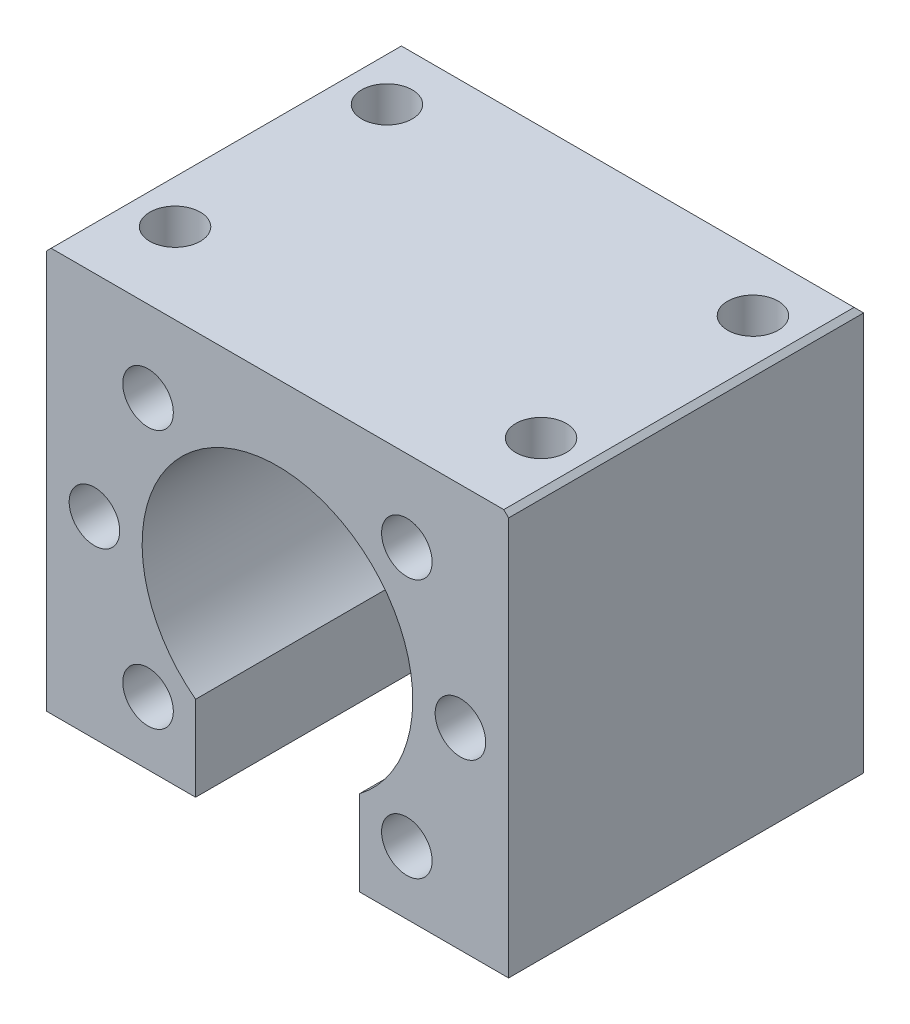
ISO-10303-21;
HEADER;
FILE_DESCRIPTION(('STEP AP214'),'2;1');
FILE_NAME('part.step','',(''),(''),'','','');
FILE_SCHEMA(('AUTOMOTIVE_DESIGN { 1 0 10303 214 1 1 1 1 }'));
ENDSEC;
DATA;
#1=APPLICATION_CONTEXT('core data for automotive mechanical design processes');
#2=APPLICATION_PROTOCOL_DEFINITION('international standard','automotive_design',2000,#1);
#3=PRODUCT_CONTEXT('',#1,'mechanical');
#4=PRODUCT('Part','Part','',(#3));
#5=PRODUCT_RELATED_PRODUCT_CATEGORY('part','',(#4));
#6=PRODUCT_DEFINITION_FORMATION('','',#4);
#7=PRODUCT_DEFINITION_CONTEXT('part definition',#1,'design');
#8=PRODUCT_DEFINITION('design','',#6,#7);
#9=PRODUCT_DEFINITION_SHAPE('','',#8);
#10=(LENGTH_UNIT() NAMED_UNIT(*) SI_UNIT(.MILLI.,.METRE.));
#11=(NAMED_UNIT(*) PLANE_ANGLE_UNIT() SI_UNIT($,.RADIAN.));
#12=(NAMED_UNIT(*) SI_UNIT($,.STERADIAN.) SOLID_ANGLE_UNIT());
#13=UNCERTAINTY_MEASURE_WITH_UNIT(LENGTH_MEASURE(1.E-05),#10,'distance_accuracy_value','');
#14=(GEOMETRIC_REPRESENTATION_CONTEXT(3) GLOBAL_UNCERTAINTY_ASSIGNED_CONTEXT((#13)) GLOBAL_UNIT_ASSIGNED_CONTEXT((#10,
#11,#12)) REPRESENTATION_CONTEXT('',''));
#15=CARTESIAN_POINT('',(0.,0.,0.));
#16=DIRECTION('',(0.,0.,1.));
#17=DIRECTION('',(1.,0.,0.));
#18=AXIS2_PLACEMENT_3D('',#15,#16,#17);
#19=CARTESIAN_POINT('',(-24.,-20.,36.8694999948));
#20=DIRECTION('',(1.,0.,0.));
#21=DIRECTION('',(0.,0.,-1.));
#22=AXIS2_PLACEMENT_3D('',#19,#20,#21);
#23=PLANE('',#22);
#24=DIRECTION('',(0.,-1.,0.));
#25=VECTOR('',#24,1.);
#26=CARTESIAN_POINT('',(-24.,-20.,36.8694999948));
#27=LINE('',#26,#25);
#28=CARTESIAN_POINT('',(-24.,21.3694999948,36.8694999948));
#29=VERTEX_POINT('',#28);
#30=CARTESIAN_POINT('',(-24.,-20.,36.8694999948));
#31=VERTEX_POINT('',#30);
#32=EDGE_CURVE('E187',#29,#31,#27,.T.);
#33=ORIENTED_EDGE('',*,*,#32,.F.);
#34=DIRECTION('',(0.,0.,-1.));
#35=VECTOR('',#34,1.);
#36=CARTESIAN_POINT('',(-24.,21.3694999948,0.));
#37=LINE('',#36,#35);
#38=CARTESIAN_POINT('',(-24.,21.3694999948,0.));
#39=VERTEX_POINT('',#38);
#40=EDGE_CURVE('E68',#29,#39,#37,.T.);
#41=ORIENTED_EDGE('',*,*,#40,.T.);
#42=DIRECTION('',(0.,-1.,0.));
#43=VECTOR('',#42,1.);
#44=CARTESIAN_POINT('',(-24.,-20.,0.));
#45=LINE('',#44,#43);
#46=CARTESIAN_POINT('',(-24.,-20.,0.));
#47=VERTEX_POINT('',#46);
#48=EDGE_CURVE('E186',#39,#47,#45,.T.);
#49=ORIENTED_EDGE('',*,*,#48,.T.);
#50=DIRECTION('',(0.,0.,-1.));
#51=VECTOR('',#50,1.);
#52=CARTESIAN_POINT('',(-24.,-20.,36.8694999948));
#53=LINE('',#52,#51);
#54=EDGE_CURVE('E233',#31,#47,#53,.T.);
#55=ORIENTED_EDGE('',*,*,#54,.F.);
#56=EDGE_LOOP('',(#33,#41,#49,#55));
#57=FACE_BOUND('',#56,.T.);
#58=ADVANCED_FACE('F44',(#57),#23,.F.);
#59=CARTESIAN_POINT('',(-8.5,-20.,36.8694999948));
#60=DIRECTION('',(0.,1.,0.));
#61=DIRECTION('',(-1.,0.,0.));
#62=AXIS2_PLACEMENT_3D('',#59,#60,#61);
#63=PLANE('',#62);
#64=DIRECTION('',(1.,0.,0.));
#65=VECTOR('',#64,1.);
#66=CARTESIAN_POINT('',(-8.5,-20.,0.));
#67=LINE('',#66,#65);
#68=CARTESIAN_POINT('',(-8.5,-20.,0.));
#69=VERTEX_POINT('',#68);
#70=EDGE_CURVE('E205',#47,#69,#67,.T.);
#71=ORIENTED_EDGE('',*,*,#70,.T.);
#72=DIRECTION('',(0.,0.,-1.));
#73=VECTOR('',#72,1.);
#74=CARTESIAN_POINT('',(-8.5,-20.,36.8694999948));
#75=LINE('',#74,#73);
#76=CARTESIAN_POINT('',(-8.5,-20.,36.8694999948));
#77=VERTEX_POINT('',#76);
#78=EDGE_CURVE('E228',#77,#69,#75,.T.);
#79=ORIENTED_EDGE('',*,*,#78,.F.);
#80=DIRECTION('',(1.,0.,0.));
#81=VECTOR('',#80,1.);
#82=CARTESIAN_POINT('',(-8.5,-20.,36.8694999948));
#83=LINE('',#82,#81);
#84=EDGE_CURVE('E189',#31,#77,#83,.T.);
#85=ORIENTED_EDGE('',*,*,#84,.F.);
#86=ORIENTED_EDGE('',*,*,#54,.T.);
#87=EDGE_LOOP('',(#71,#79,#85,#86));
#88=FACE_BOUND('',#87,.T.);
#89=ADVANCED_FACE('F302',(#88),#63,.F.);
#90=CARTESIAN_POINT('',(-8.5,-11.187157815996,36.8694999948));
#91=DIRECTION('',(-1.,0.,0.));
#92=DIRECTION('',(0.,-1.,0.));
#93=AXIS2_PLACEMENT_3D('',#90,#91,#92);
#94=PLANE('',#93);
#95=DIRECTION('',(0.,1.,0.));
#96=VECTOR('',#95,1.);
#97=CARTESIAN_POINT('',(-8.5,-11.187157815996,0.));
#98=LINE('',#97,#96);
#99=CARTESIAN_POINT('',(-8.5,-11.187157815996,0.));
#100=VERTEX_POINT('',#99);
#101=EDGE_CURVE('E207',#69,#100,#98,.T.);
#102=ORIENTED_EDGE('',*,*,#101,.T.);
#103=DIRECTION('',(0.,0.,-1.));
#104=VECTOR('',#103,1.);
#105=CARTESIAN_POINT('',(-8.5,-11.187157815996,36.8694999948));
#106=LINE('',#105,#104);
#107=CARTESIAN_POINT('',(-8.5,-11.187157815996,36.8694999948));
#108=VERTEX_POINT('',#107);
#109=EDGE_CURVE('E225',#108,#100,#106,.T.);
#110=ORIENTED_EDGE('',*,*,#109,.F.);
#111=DIRECTION('',(0.,1.,0.));
#112=VECTOR('',#111,1.);
#113=CARTESIAN_POINT('',(-8.5,-11.187157815996,36.8694999948));
#114=LINE('',#113,#112);
#115=EDGE_CURVE('E192',#77,#108,#114,.T.);
#116=ORIENTED_EDGE('',*,*,#115,.F.);
#117=ORIENTED_EDGE('',*,*,#78,.T.);
#118=EDGE_LOOP('',(#102,#110,#116,#117));
#119=FACE_BOUND('',#118,.T.);
#120=ADVANCED_FACE('F307',(#119),#94,.F.);
#121=CARTESIAN_POINT('',(0.,0.,36.8694999948));
#122=DIRECTION('',(0.,0.,-1.));
#123=DIRECTION('',(-1.,0.,0.));
#124=AXIS2_PLACEMENT_3D('',#121,#122,#123);
#125=CYLINDRICAL_SURFACE('',#124,14.05);
#126=CARTESIAN_POINT('',(0.,0.,0.));
#127=DIRECTION('',(0.,0.,-1.));
#128=DIRECTION('',(1.,0.,0.));
#129=AXIS2_PLACEMENT_3D('',#126,#127,#128);
#130=CIRCLE('',#129,14.05);
#131=CARTESIAN_POINT('',(8.5,-11.187157815996,0.));
#132=VERTEX_POINT('',#131);
#133=EDGE_CURVE('E209',#100,#132,#130,.T.);
#134=ORIENTED_EDGE('',*,*,#133,.T.);
#135=DIRECTION('',(0.,0.,-1.));
#136=VECTOR('',#135,1.);
#137=CARTESIAN_POINT('',(8.5,-11.187157815996,36.8694999948));
#138=LINE('',#137,#136);
#139=CARTESIAN_POINT('',(8.5,-11.187157815996,36.8694999948));
#140=VERTEX_POINT('',#139);
#141=EDGE_CURVE('E222',#140,#132,#138,.T.);
#142=ORIENTED_EDGE('',*,*,#141,.F.);
#143=CARTESIAN_POINT('',(0.,0.,36.8694999948));
#144=DIRECTION('',(0.,0.,-1.));
#145=DIRECTION('',(1.,0.,0.));
#146=AXIS2_PLACEMENT_3D('',#143,#144,#145);
#147=CIRCLE('',#146,14.05);
#148=EDGE_CURVE('E194',#108,#140,#147,.T.);
#149=ORIENTED_EDGE('',*,*,#148,.F.);
#150=ORIENTED_EDGE('',*,*,#109,.T.);
#151=EDGE_LOOP('',(#134,#142,#149,#150));
#152=FACE_BOUND('',#151,.T.);
#153=ADVANCED_FACE('F348',(#152),#125,.F.);
#154=CARTESIAN_POINT('',(8.50000000000001,-20.,36.8694999948));
#155=DIRECTION('',(1.,0.,0.));
#156=DIRECTION('',(0.,1.,0.));
#157=AXIS2_PLACEMENT_3D('',#154,#155,#156);
#158=PLANE('',#157);
#159=DIRECTION('',(0.,-1.,0.));
#160=VECTOR('',#159,1.);
#161=CARTESIAN_POINT('',(8.50000000000001,-20.,0.));
#162=LINE('',#161,#160);
#163=CARTESIAN_POINT('',(8.50000000000001,-20.,0.));
#164=VERTEX_POINT('',#163);
#165=EDGE_CURVE('E211',#132,#164,#162,.T.);
#166=ORIENTED_EDGE('',*,*,#165,.T.);
#167=DIRECTION('',(0.,0.,-1.));
#168=VECTOR('',#167,1.);
#169=CARTESIAN_POINT('',(8.50000000000001,-20.,36.8694999948));
#170=LINE('',#169,#168);
#171=CARTESIAN_POINT('',(8.50000000000001,-20.,36.8694999948));
#172=VERTEX_POINT('',#171);
#173=EDGE_CURVE('E217',#172,#164,#170,.T.);
#174=ORIENTED_EDGE('',*,*,#173,.F.);
#175=DIRECTION('',(0.,-1.,0.));
#176=VECTOR('',#175,1.);
#177=CARTESIAN_POINT('',(8.50000000000001,-20.,36.8694999948));
#178=LINE('',#177,#176);
#179=EDGE_CURVE('E196',#140,#172,#178,.T.);
#180=ORIENTED_EDGE('',*,*,#179,.F.);
#181=ORIENTED_EDGE('',*,*,#141,.T.);
#182=EDGE_LOOP('',(#166,#174,#180,#181));
#183=FACE_BOUND('',#182,.T.);
#184=ADVANCED_FACE('F353',(#183),#158,.F.);
#185=CARTESIAN_POINT('',(24.,-20.,36.8694999948));
#186=DIRECTION('',(0.,1.,0.));
#187=DIRECTION('',(-1.,0.,0.));
#188=AXIS2_PLACEMENT_3D('',#185,#186,#187);
#189=PLANE('',#188);
#190=DIRECTION('',(1.,0.,0.));
#191=VECTOR('',#190,1.);
#192=CARTESIAN_POINT('',(24.,-20.,0.));
#193=LINE('',#192,#191);
#194=CARTESIAN_POINT('',(24.,-20.,0.));
#195=VERTEX_POINT('',#194);
#196=EDGE_CURVE('E213',#164,#195,#193,.T.);
#197=ORIENTED_EDGE('',*,*,#196,.T.);
#198=DIRECTION('',(0.,0.,-1.));
#199=VECTOR('',#198,1.);
#200=CARTESIAN_POINT('',(24.,-20.,36.8694999948));
#201=LINE('',#200,#199);
#202=CARTESIAN_POINT('',(24.,-20.,36.8694999948));
#203=VERTEX_POINT('',#202);
#204=EDGE_CURVE('E203',#203,#195,#201,.T.);
#205=ORIENTED_EDGE('',*,*,#204,.F.);
#206=DIRECTION('',(1.,0.,0.));
#207=VECTOR('',#206,1.);
#208=CARTESIAN_POINT('',(24.,-20.,36.8694999948));
#209=LINE('',#208,#207);
#210=EDGE_CURVE('E198',#172,#203,#209,.T.);
#211=ORIENTED_EDGE('',*,*,#210,.F.);
#212=ORIENTED_EDGE('',*,*,#173,.T.);
#213=EDGE_LOOP('',(#197,#205,#211,#212));
#214=FACE_BOUND('',#213,.T.);
#215=ADVANCED_FACE('F357',(#214),#189,.F.);
#216=CARTESIAN_POINT('',(24.,20.,36.8694999948));
#217=DIRECTION('',(-1.,0.,0.));
#218=DIRECTION('',(0.,-1.,0.));
#219=AXIS2_PLACEMENT_3D('',#216,#217,#218);
#220=PLANE('',#219);
#221=DIRECTION('',(0.,1.,0.));
#222=VECTOR('',#221,1.);
#223=CARTESIAN_POINT('',(24.,20.,0.));
#224=LINE('',#223,#222);
#225=CARTESIAN_POINT('',(24.,21.3694999948,0.));
#226=VERTEX_POINT('',#225);
#227=EDGE_CURVE('E190',#195,#226,#224,.T.);
#228=ORIENTED_EDGE('',*,*,#227,.T.);
#229=DIRECTION('',(0.,0.,1.));
#230=VECTOR('',#229,1.);
#231=CARTESIAN_POINT('',(24.,21.3694999948,36.8694999948));
#232=LINE('',#231,#230);
#233=CARTESIAN_POINT('',(24.,21.3694999948,36.8694999948));
#234=VERTEX_POINT('',#233);
#235=EDGE_CURVE('E12',#226,#234,#232,.T.);
#236=ORIENTED_EDGE('',*,*,#235,.T.);
#237=DIRECTION('',(0.,1.,0.));
#238=VECTOR('',#237,1.);
#239=CARTESIAN_POINT('',(24.,20.,36.8694999948));
#240=LINE('',#239,#238);
#241=EDGE_CURVE('E200',#203,#234,#240,.T.);
#242=ORIENTED_EDGE('',*,*,#241,.F.);
#243=ORIENTED_EDGE('',*,*,#204,.T.);
#244=EDGE_LOOP('',(#228,#236,#242,#243));
#245=FACE_BOUND('',#244,.T.);
#246=ADVANCED_FACE('F360',(#245),#220,.F.);
#247=CARTESIAN_POINT('',(0.,0.,36.8694999948));
#248=DIRECTION('',(0.,0.,1.));
#249=DIRECTION('',(1.,0.,0.));
#250=AXIS2_PLACEMENT_3D('',#247,#248,#249);
#251=PLANE('',#250);
#252=CARTESIAN_POINT('',(-19.,0.,36.8694999948));
#253=DIRECTION('',(0.,0.,1.));
#254=DIRECTION('',(1.,0.,0.));
#255=AXIS2_PLACEMENT_3D('',#252,#253,#254);
#256=CIRCLE('',#255,2.625);
#257=CARTESIAN_POINT('',(-16.375,0.,36.8694999948));
#258=VERTEX_POINT('',#257);
#259=EDGE_CURVE('E150',#258,#258,#256,.T.);
#260=ORIENTED_EDGE('',*,*,#259,.F.);
#261=EDGE_LOOP('',(#260));
#262=FACE_BOUND('',#261,.T.);
#263=CARTESIAN_POINT('',(-13.4350288425444,-13.4350288425444,36.8694999948));
#264=DIRECTION('',(0.,0.,1.));
#265=DIRECTION('',(1.,0.,0.));
#266=AXIS2_PLACEMENT_3D('',#263,#264,#265);
#267=CIRCLE('',#266,2.625);
#268=CARTESIAN_POINT('',(-10.8100288425444,-13.4350288425444,36.8694999948));
#269=VERTEX_POINT('',#268);
#270=EDGE_CURVE('E149',#269,#269,#267,.T.);
#271=ORIENTED_EDGE('',*,*,#270,.F.);
#272=EDGE_LOOP('',(#271));
#273=FACE_BOUND('',#272,.T.);
#274=CARTESIAN_POINT('',(-13.4350288425444,13.4350288425444,36.8694999948));
#275=DIRECTION('',(0.,0.,1.));
#276=DIRECTION('',(1.,0.,0.));
#277=AXIS2_PLACEMENT_3D('',#274,#275,#276);
#278=CIRCLE('',#277,2.625);
#279=CARTESIAN_POINT('',(-10.8100288425444,13.4350288425444,36.8694999948));
#280=VERTEX_POINT('',#279);
#281=EDGE_CURVE('E162',#280,#280,#278,.T.);
#282=ORIENTED_EDGE('',*,*,#281,.F.);
#283=EDGE_LOOP('',(#282));
#284=FACE_BOUND('',#283,.T.);
#285=CARTESIAN_POINT('',(13.4350288425444,13.4350288425444,36.8694999948));
#286=DIRECTION('',(0.,0.,1.));
#287=DIRECTION('',(1.,0.,0.));
#288=AXIS2_PLACEMENT_3D('',#285,#286,#287);
#289=CIRCLE('',#288,2.625);
#290=CARTESIAN_POINT('',(16.0600288425444,13.4350288425444,36.8694999948));
#291=VERTEX_POINT('',#290);
#292=EDGE_CURVE('E168',#291,#291,#289,.T.);
#293=ORIENTED_EDGE('',*,*,#292,.F.);
#294=EDGE_LOOP('',(#293));
#295=FACE_BOUND('',#294,.T.);
#296=CARTESIAN_POINT('',(19.,0.,36.8694999948));
#297=DIRECTION('',(0.,0.,1.));
#298=DIRECTION('',(1.,0.,0.));
#299=AXIS2_PLACEMENT_3D('',#296,#297,#298);
#300=CIRCLE('',#299,2.625);
#301=CARTESIAN_POINT('',(21.625,0.,36.8694999948));
#302=VERTEX_POINT('',#301);
#303=EDGE_CURVE('E174',#302,#302,#300,.T.);
#304=ORIENTED_EDGE('',*,*,#303,.F.);
#305=EDGE_LOOP('',(#304));
#306=FACE_BOUND('',#305,.T.);
#307=CARTESIAN_POINT('',(13.4350288425444,-13.4350288425444,36.8694999948));
#308=DIRECTION('',(0.,0.,1.));
#309=DIRECTION('',(1.,0.,0.));
#310=AXIS2_PLACEMENT_3D('',#307,#308,#309);
#311=CIRCLE('',#310,2.625);
#312=CARTESIAN_POINT('',(16.0600288425444,-13.4350288425444,36.8694999948));
#313=VERTEX_POINT('',#312);
#314=EDGE_CURVE('E180',#313,#313,#311,.T.);
#315=ORIENTED_EDGE('',*,*,#314,.F.);
#316=EDGE_LOOP('',(#315));
#317=FACE_BOUND('',#316,.T.);
#318=DIRECTION('',(1.,0.,0.));
#319=VECTOR('',#318,1.);
#320=CARTESIAN_POINT('',(-24.,21.8694999948,36.8694999948));
#321=LINE('',#320,#319);
#322=CARTESIAN_POINT('',(-23.5,21.8694999948,36.8694999948));
#323=VERTEX_POINT('',#322);
#324=CARTESIAN_POINT('',(23.5,21.8694999948,36.8694999948));
#325=VERTEX_POINT('',#324);
#326=EDGE_CURVE('E272',#323,#325,#321,.T.);
#327=ORIENTED_EDGE('',*,*,#326,.F.);
#328=DIRECTION('',(-0.707106781186548,-0.707106781186548,0.));
#329=VECTOR('',#328,1.);
#330=CARTESIAN_POINT('',(-22.6847499974,22.6847499974,36.8694999948));
#331=LINE('',#330,#329);
#332=EDGE_CURVE('E245',#323,#29,#331,.T.);
#333=ORIENTED_EDGE('',*,*,#332,.T.);
#334=ORIENTED_EDGE('',*,*,#32,.T.);
#335=ORIENTED_EDGE('',*,*,#84,.T.);
#336=ORIENTED_EDGE('',*,*,#115,.T.);
#337=ORIENTED_EDGE('',*,*,#148,.T.);
#338=ORIENTED_EDGE('',*,*,#179,.T.);
#339=ORIENTED_EDGE('',*,*,#210,.T.);
#340=ORIENTED_EDGE('',*,*,#241,.T.);
#341=DIRECTION('',(-0.707106781186548,0.707106781186548,0.));
#342=VECTOR('',#341,1.);
#343=CARTESIAN_POINT('',(22.6847499974,22.6847499974,36.8694999948));
#344=LINE('',#343,#342);
#345=EDGE_CURVE('E243',#234,#325,#344,.T.);
#346=ORIENTED_EDGE('',*,*,#345,.T.);
#347=EDGE_LOOP('',(#327,#333,#334,#335,#336,#337,#338,#339,#340,#346));
#348=FACE_BOUND('',#347,.T.);
#349=ADVANCED_FACE('F332',(#262,#273,#284,#295,#306,#317,#348),#251,.T.);
#350=CARTESIAN_POINT('',(0.,0.,0.));
#351=DIRECTION('',(0.,0.,1.));
#352=DIRECTION('',(1.,0.,0.));
#353=AXIS2_PLACEMENT_3D('',#350,#351,#352);
#354=PLANE('',#353);
#355=ORIENTED_EDGE('',*,*,#48,.F.);
#356=DIRECTION('',(1.,0.,0.));
#357=VECTOR('',#356,1.);
#358=CARTESIAN_POINT('',(24.,21.3694999948,0.));
#359=LINE('',#358,#357);
#360=EDGE_CURVE('E53',#39,#226,#359,.T.);
#361=ORIENTED_EDGE('',*,*,#360,.T.);
#362=ORIENTED_EDGE('',*,*,#227,.F.);
#363=ORIENTED_EDGE('',*,*,#196,.F.);
#364=ORIENTED_EDGE('',*,*,#165,.F.);
#365=ORIENTED_EDGE('',*,*,#133,.F.);
#366=ORIENTED_EDGE('',*,*,#101,.F.);
#367=ORIENTED_EDGE('',*,*,#70,.F.);
#368=EDGE_LOOP('',(#355,#361,#362,#363,#364,#365,#366,#367));
#369=FACE_BOUND('',#368,.T.);
#370=ADVANCED_FACE('F361',(#369),#354,.F.);
#371=CARTESIAN_POINT('',(13.4350288425444,-13.4350288425444,16.8694999948));
#372=DIRECTION('',(0.,0.,1.));
#373=DIRECTION('',(1.,0.,0.));
#374=AXIS2_PLACEMENT_3D('',#371,#372,#373);
#375=CONICAL_SURFACE('',#374,2.625,1.02974425867666);
#376=CARTESIAN_POINT('',(13.4350288425444,-13.4350288425444,15.2922408698527));
#377=VERTEX_POINT('',#376);
#378=VERTEX_LOOP('',#377);
#379=FACE_BOUND('',#378,.T.);
#380=CARTESIAN_POINT('',(13.4350288425444,-13.4350288425444,16.8694999948));
#381=DIRECTION('',(0.,0.,1.));
#382=DIRECTION('',(1.,0.,0.));
#383=AXIS2_PLACEMENT_3D('',#380,#381,#382);
#384=CIRCLE('',#383,2.625);
#385=CARTESIAN_POINT('',(16.0600288425444,-13.4350288425444,16.8694999948));
#386=VERTEX_POINT('',#385);
#387=EDGE_CURVE('E183',#386,#386,#384,.T.);
#388=ORIENTED_EDGE('',*,*,#387,.T.);
#389=EDGE_LOOP('',(#388));
#390=FACE_BOUND('',#389,.T.);
#391=ADVANCED_FACE('F363',(#379,#390),#375,.F.);
#392=CARTESIAN_POINT('',(13.4350288425444,-13.4350288425444,36.8694999948));
#393=DIRECTION('',(0.,0.,1.));
#394=DIRECTION('',(1.,0.,0.));
#395=AXIS2_PLACEMENT_3D('',#392,#393,#394);
#396=CYLINDRICAL_SURFACE('',#395,2.625);
#397=ORIENTED_EDGE('',*,*,#387,.F.);
#398=EDGE_LOOP('',(#397));
#399=FACE_BOUND('',#398,.T.);
#400=ORIENTED_EDGE('',*,*,#314,.T.);
#401=EDGE_LOOP('',(#400));
#402=FACE_BOUND('',#401,.T.);
#403=ADVANCED_FACE('F369',(#399,#402),#396,.F.);
#404=CARTESIAN_POINT('',(19.,0.,16.8694999948));
#405=DIRECTION('',(0.,0.,1.));
#406=DIRECTION('',(1.,0.,0.));
#407=AXIS2_PLACEMENT_3D('',#404,#405,#406);
#408=CONICAL_SURFACE('',#407,2.625,1.02974425867666);
#409=CARTESIAN_POINT('',(19.,0.,15.2922408698527));
#410=VERTEX_POINT('',#409);
#411=VERTEX_LOOP('',#410);
#412=FACE_BOUND('',#411,.T.);
#413=CARTESIAN_POINT('',(19.,0.,16.8694999948));
#414=DIRECTION('',(0.,0.,1.));
#415=DIRECTION('',(1.,0.,0.));
#416=AXIS2_PLACEMENT_3D('',#413,#414,#415);
#417=CIRCLE('',#416,2.625);
#418=CARTESIAN_POINT('',(21.625,0.,16.8694999948));
#419=VERTEX_POINT('',#418);
#420=EDGE_CURVE('E177',#419,#419,#417,.T.);
#421=ORIENTED_EDGE('',*,*,#420,.T.);
#422=EDGE_LOOP('',(#421));
#423=FACE_BOUND('',#422,.T.);
#424=ADVANCED_FACE('F610',(#412,#423),#408,.F.);
#425=CARTESIAN_POINT('',(19.,0.,36.8694999948));
#426=DIRECTION('',(0.,0.,1.));
#427=DIRECTION('',(1.,0.,0.));
#428=AXIS2_PLACEMENT_3D('',#425,#426,#427);
#429=CYLINDRICAL_SURFACE('',#428,2.625);
#430=ORIENTED_EDGE('',*,*,#420,.F.);
#431=EDGE_LOOP('',(#430));
#432=FACE_BOUND('',#431,.T.);
#433=ORIENTED_EDGE('',*,*,#303,.T.);
#434=EDGE_LOOP('',(#433));
#435=FACE_BOUND('',#434,.T.);
#436=ADVANCED_FACE('F600',(#432,#435),#429,.F.);
#437=CARTESIAN_POINT('',(13.4350288425444,13.4350288425444,16.8694999948));
#438=DIRECTION('',(0.,0.,1.));
#439=DIRECTION('',(1.,0.,0.));
#440=AXIS2_PLACEMENT_3D('',#437,#438,#439);
#441=CONICAL_SURFACE('',#440,2.625,1.02974425867666);
#442=CARTESIAN_POINT('',(13.4350288425444,13.4350288425444,15.2922408698527));
#443=VERTEX_POINT('',#442);
#444=VERTEX_LOOP('',#443);
#445=FACE_BOUND('',#444,.T.);
#446=CARTESIAN_POINT('',(13.4350288425444,13.4350288425444,16.8694999948));
#447=DIRECTION('',(0.,0.,1.));
#448=DIRECTION('',(1.,0.,0.));
#449=AXIS2_PLACEMENT_3D('',#446,#447,#448);
#450=CIRCLE('',#449,2.625);
#451=CARTESIAN_POINT('',(16.0600288425444,13.4350288425444,16.8694999948));
#452=VERTEX_POINT('',#451);
#453=EDGE_CURVE('E171',#452,#452,#450,.T.);
#454=ORIENTED_EDGE('',*,*,#453,.T.);
#455=EDGE_LOOP('',(#454));
#456=FACE_BOUND('',#455,.T.);
#457=ADVANCED_FACE('F589',(#445,#456),#441,.F.);
#458=CARTESIAN_POINT('',(13.4350288425444,13.4350288425444,36.8694999948));
#459=DIRECTION('',(0.,0.,1.));
#460=DIRECTION('',(1.,0.,0.));
#461=AXIS2_PLACEMENT_3D('',#458,#459,#460);
#462=CYLINDRICAL_SURFACE('',#461,2.625);
#463=ORIENTED_EDGE('',*,*,#453,.F.);
#464=EDGE_LOOP('',(#463));
#465=FACE_BOUND('',#464,.T.);
#466=ORIENTED_EDGE('',*,*,#292,.T.);
#467=EDGE_LOOP('',(#466));
#468=FACE_BOUND('',#467,.T.);
#469=ADVANCED_FACE('F579',(#465,#468),#462,.F.);
#470=CARTESIAN_POINT('',(-13.4350288425444,13.4350288425444,16.8694999948));
#471=DIRECTION('',(0.,0.,1.));
#472=DIRECTION('',(1.,0.,0.));
#473=AXIS2_PLACEMENT_3D('',#470,#471,#472);
#474=CONICAL_SURFACE('',#473,2.625,1.02974425867666);
#475=CARTESIAN_POINT('',(-13.4350288425444,13.4350288425444,15.2922408698527));
#476=VERTEX_POINT('',#475);
#477=VERTEX_LOOP('',#476);
#478=FACE_BOUND('',#477,.T.);
#479=CARTESIAN_POINT('',(-13.4350288425444,13.4350288425444,16.8694999948));
#480=DIRECTION('',(0.,0.,1.));
#481=DIRECTION('',(1.,0.,0.));
#482=AXIS2_PLACEMENT_3D('',#479,#480,#481);
#483=CIRCLE('',#482,2.625);
#484=CARTESIAN_POINT('',(-10.8100288425444,13.4350288425444,16.8694999948));
#485=VERTEX_POINT('',#484);
#486=EDGE_CURVE('E165',#485,#485,#483,.T.);
#487=ORIENTED_EDGE('',*,*,#486,.T.);
#488=EDGE_LOOP('',(#487));
#489=FACE_BOUND('',#488,.T.);
#490=ADVANCED_FACE('F417',(#478,#489),#474,.F.);
#491=CARTESIAN_POINT('',(-13.4350288425444,13.4350288425444,36.8694999948));
#492=DIRECTION('',(0.,0.,1.));
#493=DIRECTION('',(1.,0.,0.));
#494=AXIS2_PLACEMENT_3D('',#491,#492,#493);
#495=CYLINDRICAL_SURFACE('',#494,2.625);
#496=ORIENTED_EDGE('',*,*,#486,.F.);
#497=EDGE_LOOP('',(#496));
#498=FACE_BOUND('',#497,.T.);
#499=ORIENTED_EDGE('',*,*,#281,.T.);
#500=EDGE_LOOP('',(#499));
#501=FACE_BOUND('',#500,.T.);
#502=ADVANCED_FACE('F413',(#498,#501),#495,.F.);
#503=CARTESIAN_POINT('',(-13.4350288425444,-13.4350288425444,16.8694999948));
#504=DIRECTION('',(0.,0.,1.));
#505=DIRECTION('',(1.,0.,0.));
#506=AXIS2_PLACEMENT_3D('',#503,#504,#505);
#507=CONICAL_SURFACE('',#506,2.625,1.02974425867666);
#508=CARTESIAN_POINT('',(-13.4350288425444,-13.4350288425444,15.2922408698527));
#509=VERTEX_POINT('',#508);
#510=VERTEX_LOOP('',#509);
#511=FACE_BOUND('',#510,.T.);
#512=CARTESIAN_POINT('',(-13.4350288425444,-13.4350288425444,16.8694999948));
#513=DIRECTION('',(0.,0.,1.));
#514=DIRECTION('',(1.,0.,0.));
#515=AXIS2_PLACEMENT_3D('',#512,#513,#514);
#516=CIRCLE('',#515,2.625);
#517=CARTESIAN_POINT('',(-10.8100288425444,-13.4350288425444,16.8694999948));
#518=VERTEX_POINT('',#517);
#519=EDGE_CURVE('E153',#518,#518,#516,.T.);
#520=ORIENTED_EDGE('',*,*,#519,.T.);
#521=EDGE_LOOP('',(#520));
#522=FACE_BOUND('',#521,.T.);
#523=ADVANCED_FACE('F416',(#511,#522),#507,.F.);
#524=CARTESIAN_POINT('',(-13.4350288425444,-13.4350288425444,36.8694999948));
#525=DIRECTION('',(0.,0.,1.));
#526=DIRECTION('',(1.,0.,0.));
#527=AXIS2_PLACEMENT_3D('',#524,#525,#526);
#528=CYLINDRICAL_SURFACE('',#527,2.625);
#529=ORIENTED_EDGE('',*,*,#519,.F.);
#530=EDGE_LOOP('',(#529));
#531=FACE_BOUND('',#530,.T.);
#532=ORIENTED_EDGE('',*,*,#270,.T.);
#533=EDGE_LOOP('',(#532));
#534=FACE_BOUND('',#533,.T.);
#535=ADVANCED_FACE('F143',(#531,#534),#528,.F.);
#536=CARTESIAN_POINT('',(-19.,0.,16.8694999948));
#537=DIRECTION('',(0.,0.,1.));
#538=DIRECTION('',(1.,0.,0.));
#539=AXIS2_PLACEMENT_3D('',#536,#537,#538);
#540=CONICAL_SURFACE('',#539,2.625,1.02974425867666);
#541=CARTESIAN_POINT('',(-19.,0.,15.2922408698527));
#542=VERTEX_POINT('',#541);
#543=VERTEX_LOOP('',#542);
#544=FACE_BOUND('',#543,.T.);
#545=CARTESIAN_POINT('',(-19.,0.,16.8694999948));
#546=DIRECTION('',(0.,0.,1.));
#547=DIRECTION('',(1.,0.,0.));
#548=AXIS2_PLACEMENT_3D('',#545,#546,#547);
#549=CIRCLE('',#548,2.625);
#550=CARTESIAN_POINT('',(-16.375,0.,16.8694999948));
#551=VERTEX_POINT('',#550);
#552=EDGE_CURVE('E147',#551,#551,#549,.T.);
#553=ORIENTED_EDGE('',*,*,#552,.T.);
#554=EDGE_LOOP('',(#553));
#555=FACE_BOUND('',#554,.T.);
#556=ADVANCED_FACE('F139',(#544,#555),#540,.F.);
#557=CARTESIAN_POINT('',(-19.,0.,36.8694999948));
#558=DIRECTION('',(0.,0.,1.));
#559=DIRECTION('',(1.,0.,0.));
#560=AXIS2_PLACEMENT_3D('',#557,#558,#559);
#561=CYLINDRICAL_SURFACE('',#560,2.625);
#562=ORIENTED_EDGE('',*,*,#552,.F.);
#563=EDGE_LOOP('',(#562));
#564=FACE_BOUND('',#563,.T.);
#565=ORIENTED_EDGE('',*,*,#259,.T.);
#566=EDGE_LOOP('',(#565));
#567=FACE_BOUND('',#566,.T.);
#568=ADVANCED_FACE('F142',(#564,#567),#561,.F.);
#569=CARTESIAN_POINT('',(0.,21.8694999948,0.));
#570=DIRECTION('',(0.,1.,0.));
#571=DIRECTION('',(0.,0.,1.));
#572=AXIS2_PLACEMENT_3D('',#569,#570,#571);
#573=PLANE('',#572);
#574=CARTESIAN_POINT('',(19.,21.8694999948,6.5));
#575=DIRECTION('',(0.,1.,0.));
#576=DIRECTION('',(0.,0.,1.));
#577=AXIS2_PLACEMENT_3D('',#574,#575,#576);
#578=CIRCLE('',#577,2.625);
#579=CARTESIAN_POINT('',(19.,21.8694999948,9.125));
#580=VERTEX_POINT('',#579);
#581=EDGE_CURVE('E259',#580,#580,#578,.T.);
#582=ORIENTED_EDGE('',*,*,#581,.F.);
#583=EDGE_LOOP('',(#582));
#584=FACE_BOUND('',#583,.T.);
#585=CARTESIAN_POINT('',(-19.,21.8694999948,28.5));
#586=DIRECTION('',(0.,1.,0.));
#587=DIRECTION('',(0.,0.,1.));
#588=AXIS2_PLACEMENT_3D('',#585,#586,#587);
#589=CIRCLE('',#588,2.625);
#590=CARTESIAN_POINT('',(-19.,21.8694999948,31.125));
#591=VERTEX_POINT('',#590);
#592=EDGE_CURVE('E269',#591,#591,#589,.T.);
#593=ORIENTED_EDGE('',*,*,#592,.F.);
#594=EDGE_LOOP('',(#593));
#595=FACE_BOUND('',#594,.T.);
#596=DIRECTION('',(-1.,0.,0.));
#597=VECTOR('',#596,1.);
#598=CARTESIAN_POINT('',(-24.,21.8694999948,0.500000000000007));
#599=LINE('',#598,#597);
#600=CARTESIAN_POINT('',(23.5,21.8694999948,0.500000000000007));
#601=VERTEX_POINT('',#600);
#602=CARTESIAN_POINT('',(-23.5,21.8694999948,0.500000000000007));
#603=VERTEX_POINT('',#602);
#604=EDGE_CURVE('E238',#601,#603,#599,.T.);
#605=ORIENTED_EDGE('',*,*,#604,.T.);
#606=DIRECTION('',(0.,0.,1.));
#607=VECTOR('',#606,1.);
#608=CARTESIAN_POINT('',(-23.5,21.8694999948,36.8694999948));
#609=LINE('',#608,#607);
#610=EDGE_CURVE('E240',#603,#323,#609,.T.);
#611=ORIENTED_EDGE('',*,*,#610,.T.);
#612=ORIENTED_EDGE('',*,*,#326,.T.);
#613=DIRECTION('',(0.,0.,-1.));
#614=VECTOR('',#613,1.);
#615=CARTESIAN_POINT('',(23.5,21.8694999948,0.));
#616=LINE('',#615,#614);
#617=EDGE_CURVE('E236',#325,#601,#616,.T.);
#618=ORIENTED_EDGE('',*,*,#617,.T.);
#619=EDGE_LOOP('',(#605,#611,#612,#618));
#620=FACE_BOUND('',#619,.T.);
#621=CARTESIAN_POINT('',(-19.,21.8694999948,6.5));
#622=DIRECTION('',(0.,1.,0.));
#623=DIRECTION('',(0.,0.,1.));
#624=AXIS2_PLACEMENT_3D('',#621,#622,#623);
#625=CIRCLE('',#624,2.625);
#626=CARTESIAN_POINT('',(-19.,21.8694999948,9.125));
#627=VERTEX_POINT('',#626);
#628=EDGE_CURVE('E264',#627,#627,#625,.T.);
#629=ORIENTED_EDGE('',*,*,#628,.F.);
#630=EDGE_LOOP('',(#629));
#631=FACE_BOUND('',#630,.T.);
#632=CARTESIAN_POINT('',(19.,21.8694999948,28.5));
#633=DIRECTION('',(0.,1.,0.));
#634=DIRECTION('',(0.,0.,1.));
#635=AXIS2_PLACEMENT_3D('',#632,#633,#634);
#636=CIRCLE('',#635,2.625);
#637=CARTESIAN_POINT('',(19.,21.8694999948,31.125));
#638=VERTEX_POINT('',#637);
#639=EDGE_CURVE('E254',#638,#638,#636,.T.);
#640=ORIENTED_EDGE('',*,*,#639,.F.);
#641=EDGE_LOOP('',(#640));
#642=FACE_BOUND('',#641,.T.);
#643=ADVANCED_FACE('F299',(#584,#595,#620,#631,#642),#573,.T.);
#644=CARTESIAN_POINT('',(19.,3.,28.5));
#645=DIRECTION('',(0.,-1.,0.));
#646=DIRECTION('',(0.,0.,-1.));
#647=AXIS2_PLACEMENT_3D('',#644,#645,#646);
#648=PLANE('',#647);
#649=CARTESIAN_POINT('',(19.,3.,28.5));
#650=DIRECTION('',(0.,1.,0.));
#651=DIRECTION('',(0.,0.,1.));
#652=AXIS2_PLACEMENT_3D('',#649,#650,#651);
#653=CIRCLE('',#652,2.62500000000001);
#654=CARTESIAN_POINT('',(19.,3.,31.125));
#655=VERTEX_POINT('',#654);
#656=EDGE_CURVE('E156',#655,#655,#653,.T.);
#657=ORIENTED_EDGE('',*,*,#656,.T.);
#658=EDGE_LOOP('',(#657));
#659=FACE_BOUND('',#658,.T.);
#660=ADVANCED_FACE('F286',(#659),#648,.F.);
#661=CARTESIAN_POINT('',(19.,20.,28.5));
#662=DIRECTION('',(0.,1.,0.));
#663=DIRECTION('',(0.,0.,1.));
#664=AXIS2_PLACEMENT_3D('',#661,#662,#663);
#665=CYLINDRICAL_SURFACE('',#664,2.62500000000001);
#666=ORIENTED_EDGE('',*,*,#656,.F.);
#667=EDGE_LOOP('',(#666));
#668=FACE_BOUND('',#667,.T.);
#669=ORIENTED_EDGE('',*,*,#639,.T.);
#670=EDGE_LOOP('',(#669));
#671=FACE_BOUND('',#670,.T.);
#672=ADVANCED_FACE('F288',(#668,#671),#665,.F.);
#673=CARTESIAN_POINT('',(-19.,3.,28.5));
#674=DIRECTION('',(0.,-1.,0.));
#675=DIRECTION('',(0.,0.,-1.));
#676=AXIS2_PLACEMENT_3D('',#673,#674,#675);
#677=PLANE('',#676);
#678=CARTESIAN_POINT('',(-19.,3.,28.5));
#679=DIRECTION('',(0.,1.,0.));
#680=DIRECTION('',(0.,0.,1.));
#681=AXIS2_PLACEMENT_3D('',#678,#679,#680);
#682=CIRCLE('',#681,2.62500000000001);
#683=CARTESIAN_POINT('',(-19.,3.,31.125));
#684=VERTEX_POINT('',#683);
#685=EDGE_CURVE('E281',#684,#684,#682,.T.);
#686=ORIENTED_EDGE('',*,*,#685,.T.);
#687=EDGE_LOOP('',(#686));
#688=FACE_BOUND('',#687,.T.);
#689=ADVANCED_FACE('F290',(#688),#677,.F.);
#690=CARTESIAN_POINT('',(-19.,20.,28.5));
#691=DIRECTION('',(0.,1.,0.));
#692=DIRECTION('',(0.,0.,1.));
#693=AXIS2_PLACEMENT_3D('',#690,#691,#692);
#694=CYLINDRICAL_SURFACE('',#693,2.62500000000001);
#695=ORIENTED_EDGE('',*,*,#685,.F.);
#696=EDGE_LOOP('',(#695));
#697=FACE_BOUND('',#696,.T.);
#698=ORIENTED_EDGE('',*,*,#592,.T.);
#699=EDGE_LOOP('',(#698));
#700=FACE_BOUND('',#699,.T.);
#701=ADVANCED_FACE('F296',(#697,#700),#694,.F.);
#702=CARTESIAN_POINT('',(19.,3.,6.5));
#703=DIRECTION('',(0.,-1.,0.));
#704=DIRECTION('',(0.,0.,-1.));
#705=AXIS2_PLACEMENT_3D('',#702,#703,#704);
#706=PLANE('',#705);
#707=CARTESIAN_POINT('',(19.,3.,6.5));
#708=DIRECTION('',(0.,1.,0.));
#709=DIRECTION('',(0.,0.,1.));
#710=AXIS2_PLACEMENT_3D('',#707,#708,#709);
#711=CIRCLE('',#710,2.62500000000001);
#712=CARTESIAN_POINT('',(19.,3.,9.12500000000001));
#713=VERTEX_POINT('',#712);
#714=EDGE_CURVE('E278',#713,#713,#711,.T.);
#715=ORIENTED_EDGE('',*,*,#714,.T.);
#716=EDGE_LOOP('',(#715));
#717=FACE_BOUND('',#716,.T.);
#718=ADVANCED_FACE('F428',(#717),#706,.F.);
#719=CARTESIAN_POINT('',(19.,20.,6.5));
#720=DIRECTION('',(0.,1.,0.));
#721=DIRECTION('',(0.,0.,1.));
#722=AXIS2_PLACEMENT_3D('',#719,#720,#721);
#723=CYLINDRICAL_SURFACE('',#722,2.62500000000001);
#724=ORIENTED_EDGE('',*,*,#714,.F.);
#725=EDGE_LOOP('',(#724));
#726=FACE_BOUND('',#725,.T.);
#727=ORIENTED_EDGE('',*,*,#581,.T.);
#728=EDGE_LOOP('',(#727));
#729=FACE_BOUND('',#728,.T.);
#730=ADVANCED_FACE('F441',(#726,#729),#723,.F.);
#731=CARTESIAN_POINT('',(-19.,3.,6.5));
#732=DIRECTION('',(0.,-1.,0.));
#733=DIRECTION('',(0.,0.,-1.));
#734=AXIS2_PLACEMENT_3D('',#731,#732,#733);
#735=PLANE('',#734);
#736=CARTESIAN_POINT('',(-19.,3.,6.5));
#737=DIRECTION('',(0.,1.,0.));
#738=DIRECTION('',(0.,0.,1.));
#739=AXIS2_PLACEMENT_3D('',#736,#737,#738);
#740=CIRCLE('',#739,2.62500000000001);
#741=CARTESIAN_POINT('',(-19.,3.,9.12500000000001));
#742=VERTEX_POINT('',#741);
#743=EDGE_CURVE('E275',#742,#742,#740,.T.);
#744=ORIENTED_EDGE('',*,*,#743,.T.);
#745=EDGE_LOOP('',(#744));
#746=FACE_BOUND('',#745,.T.);
#747=ADVANCED_FACE('F324',(#746),#735,.F.);
#748=CARTESIAN_POINT('',(-19.,20.,6.5));
#749=DIRECTION('',(0.,1.,0.));
#750=DIRECTION('',(0.,0.,1.));
#751=AXIS2_PLACEMENT_3D('',#748,#749,#750);
#752=CYLINDRICAL_SURFACE('',#751,2.62500000000001);
#753=ORIENTED_EDGE('',*,*,#743,.F.);
#754=EDGE_LOOP('',(#753));
#755=FACE_BOUND('',#754,.T.);
#756=ORIENTED_EDGE('',*,*,#628,.T.);
#757=EDGE_LOOP('',(#756));
#758=FACE_BOUND('',#757,.T.);
#759=ADVANCED_FACE('F319',(#755,#758),#752,.F.);
#760=CARTESIAN_POINT('',(23.5,21.8694999948,0.));
#761=DIRECTION('',(0.707106781186547,0.707106781186547,0.));
#762=DIRECTION('',(0.,0.,1.));
#763=AXIS2_PLACEMENT_3D('',#760,#761,#762);
#764=PLANE('',#763);
#765=ORIENTED_EDGE('',*,*,#345,.F.);
#766=ORIENTED_EDGE('',*,*,#235,.F.);
#767=DIRECTION('',(-0.577350269189626,0.577350269189626,0.577350269189626));
#768=VECTOR('',#767,1.);
#769=CARTESIAN_POINT('',(23.6666666666667,21.7028333281333,0.333333333333338));
#770=LINE('',#769,#768);
#771=EDGE_CURVE('E48',#601,#226,#770,.F.);
#772=ORIENTED_EDGE('',*,*,#771,.F.);
#773=ORIENTED_EDGE('',*,*,#617,.F.);
#774=EDGE_LOOP('',(#765,#766,#772,#773));
#775=FACE_BOUND('',#774,.T.);
#776=ADVANCED_FACE('F46',(#775),#764,.T.);
#777=CARTESIAN_POINT('',(0.,21.8694999948,0.500000000000007));
#778=DIRECTION('',(0.,0.707106781186547,-0.707106781186547));
#779=DIRECTION('',(1.,0.,0.));
#780=AXIS2_PLACEMENT_3D('',#777,#778,#779);
#781=PLANE('',#780);
#782=ORIENTED_EDGE('',*,*,#771,.T.);
#783=ORIENTED_EDGE('',*,*,#360,.F.);
#784=DIRECTION('',(0.577350269189626,0.577350269189626,0.577350269189626));
#785=VECTOR('',#784,1.);
#786=CARTESIAN_POINT('',(-15.6666666666667,29.7028333281333,8.33333333333334));
#787=LINE('',#786,#785);
#788=EDGE_CURVE('E248',#603,#39,#787,.F.);
#789=ORIENTED_EDGE('',*,*,#788,.F.);
#790=ORIENTED_EDGE('',*,*,#604,.F.);
#791=EDGE_LOOP('',(#782,#783,#789,#790));
#792=FACE_BOUND('',#791,.T.);
#793=ADVANCED_FACE('F314',(#792),#781,.T.);
#794=CARTESIAN_POINT('',(-23.5,21.8694999948,0.));
#795=DIRECTION('',(-0.707106781186547,0.707106781186547,0.));
#796=DIRECTION('',(0.,0.,-1.));
#797=AXIS2_PLACEMENT_3D('',#794,#795,#796);
#798=PLANE('',#797);
#799=ORIENTED_EDGE('',*,*,#788,.T.);
#800=ORIENTED_EDGE('',*,*,#40,.F.);
#801=ORIENTED_EDGE('',*,*,#332,.F.);
#802=ORIENTED_EDGE('',*,*,#610,.F.);
#803=EDGE_LOOP('',(#799,#800,#801,#802));
#804=FACE_BOUND('',#803,.T.);
#805=ADVANCED_FACE('F312',(#804),#798,.T.);
#806=CLOSED_SHELL('',(#58,#89,#120,#153,#184,#215,#246,#349,#370,#391,#403,#424,#436,#457,#469,
#490,#502,#523,#535,#556,#568,#643,#660,#672,#689,#701,#718,#730,#747,#759,#776,#793,#805));
#807=MANIFOLD_SOLID_BREP('B2',#806);
#808=ADVANCED_BREP_SHAPE_REPRESENTATION('',(#18,#807),#14);
#809=SHAPE_DEFINITION_REPRESENTATION(#9,#808);
ENDSEC;
END-ISO-10303-21;
